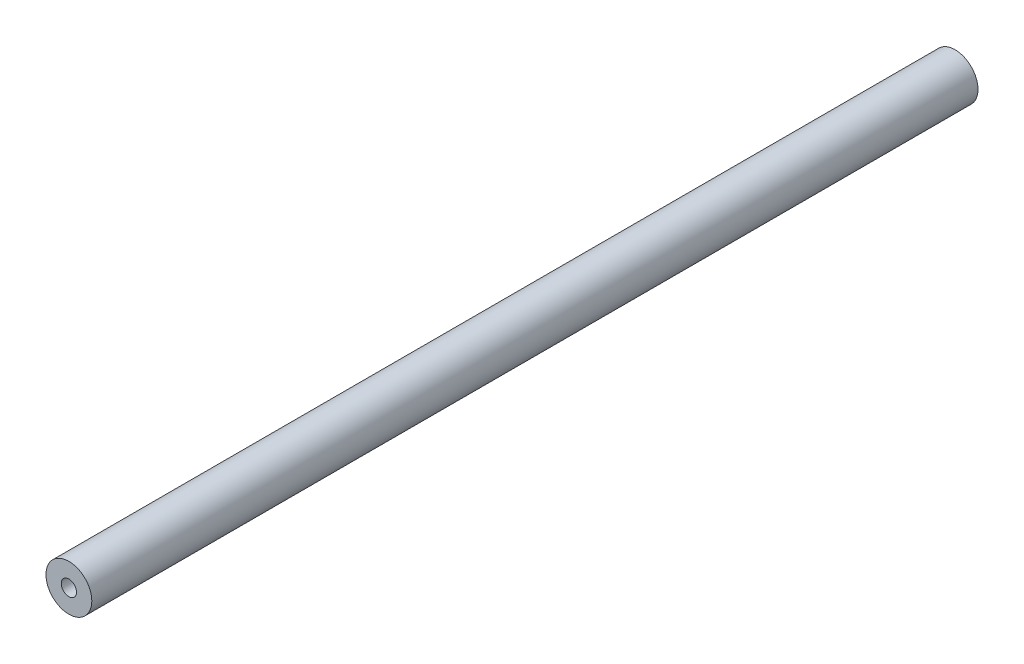
ISO-10303-21;
HEADER;
FILE_DESCRIPTION(('STEP AP214'),'2;1');
FILE_NAME('part.step','',(''),(''),'','','');
FILE_SCHEMA(('AUTOMOTIVE_DESIGN { 1 0 10303 214 1 1 1 1 }'));
ENDSEC;
DATA;
#1=APPLICATION_CONTEXT('core data for automotive mechanical design processes');
#2=APPLICATION_PROTOCOL_DEFINITION('international standard','automotive_design',2000,#1);
#3=PRODUCT_CONTEXT('',#1,'mechanical');
#4=PRODUCT('Part','Part','',(#3));
#5=PRODUCT_RELATED_PRODUCT_CATEGORY('part','',(#4));
#6=PRODUCT_DEFINITION_FORMATION('','',#4);
#7=PRODUCT_DEFINITION_CONTEXT('part definition',#1,'design');
#8=PRODUCT_DEFINITION('design','',#6,#7);
#9=PRODUCT_DEFINITION_SHAPE('','',#8);
#10=(LENGTH_UNIT() NAMED_UNIT(*) SI_UNIT(.MILLI.,.METRE.));
#11=(NAMED_UNIT(*) PLANE_ANGLE_UNIT() SI_UNIT($,.RADIAN.));
#12=(NAMED_UNIT(*) SI_UNIT($,.STERADIAN.) SOLID_ANGLE_UNIT());
#13=UNCERTAINTY_MEASURE_WITH_UNIT(LENGTH_MEASURE(1.E-05),#10,'distance_accuracy_value','');
#14=(GEOMETRIC_REPRESENTATION_CONTEXT(3) GLOBAL_UNCERTAINTY_ASSIGNED_CONTEXT((#13)) GLOBAL_UNIT_ASSIGNED_CONTEXT((#10,
#11,#12)) REPRESENTATION_CONTEXT('',''));
#15=CARTESIAN_POINT('',(0.,0.,0.));
#16=DIRECTION('',(0.,0.,1.));
#17=DIRECTION('',(1.,0.,0.));
#18=AXIS2_PLACEMENT_3D('',#15,#16,#17);
#19=CARTESIAN_POINT('',(0.,0.,0.));
#20=DIRECTION('',(0.,0.,1.));
#21=DIRECTION('',(1.,0.,0.));
#22=AXIS2_PLACEMENT_3D('',#19,#20,#21);
#23=CYLINDRICAL_SURFACE('',#22,0.5);
#24=CARTESIAN_POINT('',(0.,0.,0.));
#25=DIRECTION('',(0.,0.,1.));
#26=DIRECTION('',(1.,0.,0.));
#27=AXIS2_PLACEMENT_3D('',#24,#25,#26);
#28=CIRCLE('',#27,0.5);
#29=CARTESIAN_POINT('',(0.5,0.,0.));
#30=VERTEX_POINT('',#29);
#31=EDGE_CURVE('E26',#30,#30,#28,.T.);
#32=ORIENTED_EDGE('',*,*,#31,.F.);
#33=EDGE_LOOP('',(#32));
#34=FACE_BOUND('',#33,.T.);
#35=CARTESIAN_POINT('',(0.,0.,58.));
#36=DIRECTION('',(0.,0.,1.));
#37=DIRECTION('',(1.,0.,0.));
#38=AXIS2_PLACEMENT_3D('',#35,#36,#37);
#39=CIRCLE('',#38,0.5);
#40=CARTESIAN_POINT('',(0.5,0.,58.));
#41=VERTEX_POINT('',#40);
#42=EDGE_CURVE('E17',#41,#41,#39,.T.);
#43=ORIENTED_EDGE('',*,*,#42,.T.);
#44=EDGE_LOOP('',(#43));
#45=FACE_BOUND('',#44,.T.);
#46=ADVANCED_FACE('F14',(#34,#45),#23,.F.);
#47=CARTESIAN_POINT('',(0.,0.,58.));
#48=DIRECTION('',(0.,0.,-1.));
#49=DIRECTION('',(-1.,0.,0.));
#50=AXIS2_PLACEMENT_3D('',#47,#48,#49);
#51=PLANE('',#50);
#52=ORIENTED_EDGE('',*,*,#42,.F.);
#53=EDGE_LOOP('',(#52));
#54=FACE_BOUND('',#53,.T.);
#55=CARTESIAN_POINT('',(0.,0.,58.));
#56=DIRECTION('',(0.,0.,1.));
#57=DIRECTION('',(1.,0.,0.));
#58=AXIS2_PLACEMENT_3D('',#55,#56,#57);
#59=CIRCLE('',#58,1.5);
#60=CARTESIAN_POINT('',(1.5,0.,58.));
#61=VERTEX_POINT('',#60);
#62=EDGE_CURVE('E21',#61,#61,#59,.F.);
#63=ORIENTED_EDGE('',*,*,#62,.F.);
#64=EDGE_LOOP('',(#63));
#65=FACE_BOUND('',#64,.T.);
#66=ADVANCED_FACE('F35',(#54,#65),#51,.F.);
#67=CARTESIAN_POINT('',(0.,0.,0.));
#68=DIRECTION('',(0.,0.,-1.));
#69=DIRECTION('',(-1.,0.,0.));
#70=AXIS2_PLACEMENT_3D('',#67,#68,#69);
#71=PLANE('',#70);
#72=ORIENTED_EDGE('',*,*,#31,.T.);
#73=EDGE_LOOP('',(#72));
#74=FACE_BOUND('',#73,.T.);
#75=CARTESIAN_POINT('',(0.,0.,0.));
#76=DIRECTION('',(0.,0.,1.));
#77=DIRECTION('',(1.,0.,0.));
#78=AXIS2_PLACEMENT_3D('',#75,#76,#77);
#79=CIRCLE('',#78,1.5);
#80=CARTESIAN_POINT('',(1.5,0.,0.));
#81=VERTEX_POINT('',#80);
#82=EDGE_CURVE('E9',#81,#81,#79,.T.);
#83=ORIENTED_EDGE('',*,*,#82,.F.);
#84=EDGE_LOOP('',(#83));
#85=FACE_BOUND('',#84,.T.);
#86=ADVANCED_FACE('F38',(#74,#85),#71,.T.);
#87=CARTESIAN_POINT('',(0.,0.,0.));
#88=DIRECTION('',(0.,0.,1.));
#89=DIRECTION('',(1.,0.,0.));
#90=AXIS2_PLACEMENT_3D('',#87,#88,#89);
#91=CYLINDRICAL_SURFACE('',#90,1.5);
#92=ORIENTED_EDGE('',*,*,#82,.T.);
#93=EDGE_LOOP('',(#92));
#94=FACE_BOUND('',#93,.T.);
#95=ORIENTED_EDGE('',*,*,#62,.T.);
#96=EDGE_LOOP('',(#95));
#97=FACE_BOUND('',#96,.T.);
#98=ADVANCED_FACE('F41',(#94,#97),#91,.T.);
#99=CLOSED_SHELL('',(#46,#66,#86,#98));
#100=MANIFOLD_SOLID_BREP('B1',#99);
#101=ADVANCED_BREP_SHAPE_REPRESENTATION('',(#18,#100),#14);
#102=SHAPE_DEFINITION_REPRESENTATION(#9,#101);
ENDSEC;
END-ISO-10303-21;
